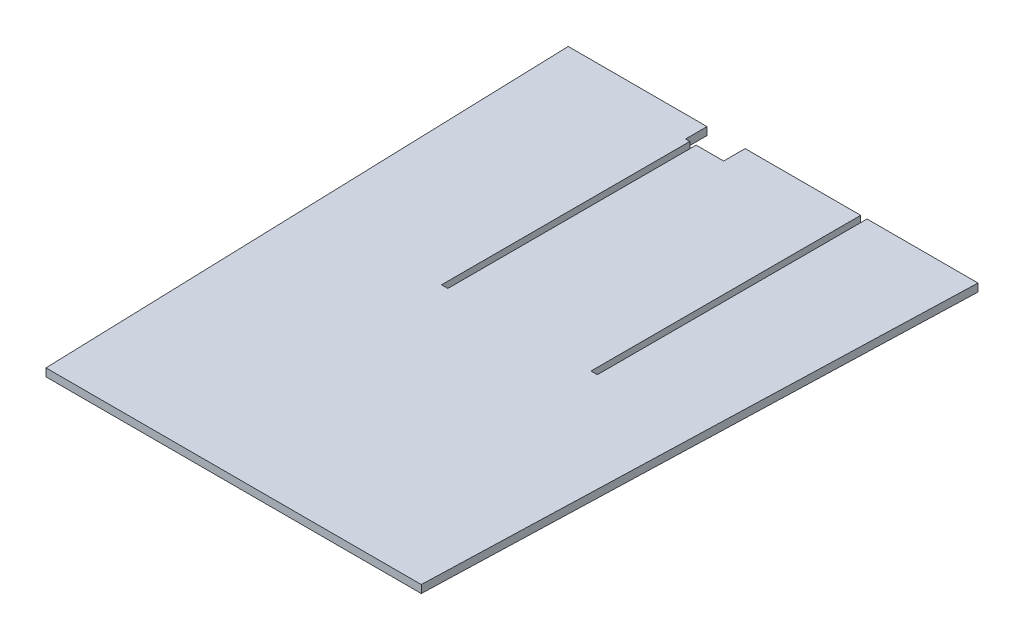
ISO-10303-21;
HEADER;
FILE_DESCRIPTION(('STEP AP214'),'2;1');
FILE_NAME('part.step','',(''),(''),'','','');
FILE_SCHEMA(('AUTOMOTIVE_DESIGN { 1 0 10303 214 1 1 1 1 }'));
ENDSEC;
DATA;
#1=APPLICATION_CONTEXT('core data for automotive mechanical design processes');
#2=APPLICATION_PROTOCOL_DEFINITION('international standard','automotive_design',2000,#1);
#3=PRODUCT_CONTEXT('',#1,'mechanical');
#4=PRODUCT('Part','Part','',(#3));
#5=PRODUCT_RELATED_PRODUCT_CATEGORY('part','',(#4));
#6=PRODUCT_DEFINITION_FORMATION('','',#4);
#7=PRODUCT_DEFINITION_CONTEXT('part definition',#1,'design');
#8=PRODUCT_DEFINITION('design','',#6,#7);
#9=PRODUCT_DEFINITION_SHAPE('','',#8);
#10=(LENGTH_UNIT() NAMED_UNIT(*) SI_UNIT(.MILLI.,.METRE.));
#11=(NAMED_UNIT(*) PLANE_ANGLE_UNIT() SI_UNIT($,.RADIAN.));
#12=(NAMED_UNIT(*) SI_UNIT($,.STERADIAN.) SOLID_ANGLE_UNIT());
#13=UNCERTAINTY_MEASURE_WITH_UNIT(LENGTH_MEASURE(1.E-05),#10,'distance_accuracy_value','');
#14=(GEOMETRIC_REPRESENTATION_CONTEXT(3) GLOBAL_UNCERTAINTY_ASSIGNED_CONTEXT((#13)) GLOBAL_UNIT_ASSIGNED_CONTEXT((#10,
#11,#12)) REPRESENTATION_CONTEXT('',''));
#15=CARTESIAN_POINT('',(0.,0.,0.));
#16=DIRECTION('',(0.,0.,1.));
#17=DIRECTION('',(1.,0.,0.));
#18=AXIS2_PLACEMENT_3D('',#15,#16,#17);
#19=CARTESIAN_POINT('',(198.579924435029,6.35,-458.637839183557));
#20=DIRECTION('',(0.,0.,-1.));
#21=DIRECTION('',(-1.,0.,0.));
#22=AXIS2_PLACEMENT_3D('',#19,#20,#21);
#23=PLANE('',#22);
#24=DIRECTION('',(1.,0.,0.));
#25=VECTOR('',#24,1.);
#26=CARTESIAN_POINT('',(198.579924435029,0.,-458.637839183557));
#27=LINE('',#26,#25);
#28=CARTESIAN_POINT('',(198.579924435029,0.,-458.637839183557));
#29=VERTEX_POINT('',#28);
#30=CARTESIAN_POINT('',(311.330524435029,0.,-458.637839183557));
#31=VERTEX_POINT('',#30);
#32=EDGE_CURVE('E192',#29,#31,#27,.T.);
#33=ORIENTED_EDGE('',*,*,#32,.F.);
#34=DIRECTION('',(0.,-1.,0.));
#35=VECTOR('',#34,1.);
#36=CARTESIAN_POINT('',(198.579924435029,6.35,-458.637839183557));
#37=LINE('',#36,#35);
#38=CARTESIAN_POINT('',(198.579924435029,6.35,-458.637839183557));
#39=VERTEX_POINT('',#38);
#40=EDGE_CURVE('E11',#39,#29,#37,.T.);
#41=ORIENTED_EDGE('',*,*,#40,.F.);
#42=DIRECTION('',(1.,0.,0.));
#43=VECTOR('',#42,1.);
#44=CARTESIAN_POINT('',(198.579924435029,6.35,-458.637839183557));
#45=LINE('',#44,#43);
#46=CARTESIAN_POINT('',(311.330524435029,6.35,-458.637839183557));
#47=VERTEX_POINT('',#46);
#48=EDGE_CURVE('E248',#39,#47,#45,.T.);
#49=ORIENTED_EDGE('',*,*,#48,.T.);
#50=DIRECTION('',(0.,-1.,0.));
#51=VECTOR('',#50,1.);
#52=CARTESIAN_POINT('',(311.330524435029,6.35,-458.637839183557));
#53=LINE('',#52,#51);
#54=EDGE_CURVE('E42',#47,#31,#53,.T.);
#55=ORIENTED_EDGE('',*,*,#54,.T.);
#56=EDGE_LOOP('',(#33,#41,#49,#55));
#57=FACE_BOUND('',#56,.T.);
#58=ADVANCED_FACE('F39',(#57),#23,.T.);
#59=CARTESIAN_POINT('',(198.579924435029,6.35,-458.637839183557));
#60=DIRECTION('',(0.99948913565602,0.,-0.0319604084076052));
#61=DIRECTION('',(-0.0319604084076052,0.,-0.999489135656021));
#62=AXIS2_PLACEMENT_3D('',#59,#60,#61);
#63=PLANE('',#62);
#64=DIRECTION('',(0.0319604084076052,0.,0.99948913565602));
#65=VECTOR('',#64,1.);
#66=CARTESIAN_POINT('',(198.579924435029,0.,-458.637839183557));
#67=LINE('',#66,#65);
#68=CARTESIAN_POINT('',(212.590534900145,0.,-20.4878391835568));
#69=VERTEX_POINT('',#68);
#70=EDGE_CURVE('E109',#29,#69,#67,.T.);
#71=ORIENTED_EDGE('',*,*,#70,.T.);
#72=DIRECTION('',(0.,-1.,0.));
#73=VECTOR('',#72,1.);
#74=CARTESIAN_POINT('',(212.590534900145,6.35,-20.4878391835568));
#75=LINE('',#74,#73);
#76=CARTESIAN_POINT('',(212.590534900145,6.35,-20.4878391835568));
#77=VERTEX_POINT('',#76);
#78=EDGE_CURVE('E49',#77,#69,#75,.T.);
#79=ORIENTED_EDGE('',*,*,#78,.F.);
#80=DIRECTION('',(0.0319604084076052,0.,0.99948913565602));
#81=VECTOR('',#80,1.);
#82=CARTESIAN_POINT('',(198.579924435029,6.35,-458.637839183557));
#83=LINE('',#82,#81);
#84=EDGE_CURVE('E166',#39,#77,#83,.T.);
#85=ORIENTED_EDGE('',*,*,#84,.F.);
#86=ORIENTED_EDGE('',*,*,#40,.T.);
#87=EDGE_LOOP('',(#71,#79,#85,#86));
#88=FACE_BOUND('',#87,.T.);
#89=ADVANCED_FACE('F386',(#88),#63,.F.);
#90=CARTESIAN_POINT('',(212.590534900145,6.35,-20.4878391835568));
#91=DIRECTION('',(0.,0.,-1.));
#92=DIRECTION('',(-1.,0.,0.));
#93=AXIS2_PLACEMENT_3D('',#90,#91,#92);
#94=PLANE('',#93);
#95=DIRECTION('',(1.,0.,0.));
#96=VECTOR('',#95,1.);
#97=CARTESIAN_POINT('',(212.590534900145,0.,-20.4878391835568));
#98=LINE('',#97,#96);
#99=CARTESIAN_POINT('',(517.390534900145,0.,-20.4878391835568));
#100=VERTEX_POINT('',#99);
#101=EDGE_CURVE('E174',#69,#100,#98,.T.);
#102=ORIENTED_EDGE('',*,*,#101,.T.);
#103=DIRECTION('',(0.,-1.,0.));
#104=VECTOR('',#103,1.);
#105=CARTESIAN_POINT('',(517.390534900145,6.35,-20.4878391835568));
#106=LINE('',#105,#104);
#107=CARTESIAN_POINT('',(517.390534900145,6.35,-20.4878391835568));
#108=VERTEX_POINT('',#107);
#109=EDGE_CURVE('E171',#108,#100,#106,.T.);
#110=ORIENTED_EDGE('',*,*,#109,.F.);
#111=DIRECTION('',(1.,0.,0.));
#112=VECTOR('',#111,1.);
#113=CARTESIAN_POINT('',(212.590534900145,6.35,-20.4878391835568));
#114=LINE('',#113,#112);
#115=EDGE_CURVE('E158',#77,#108,#114,.T.);
#116=ORIENTED_EDGE('',*,*,#115,.F.);
#117=ORIENTED_EDGE('',*,*,#78,.T.);
#118=EDGE_LOOP('',(#102,#110,#116,#117));
#119=FACE_BOUND('',#118,.T.);
#120=ADVANCED_FACE('F172',(#119),#94,.F.);
#121=CARTESIAN_POINT('',(531.401145365261,6.35,-458.637839183557));
#122=DIRECTION('',(0.99948913565602,0.,0.0319604084076051));
#123=DIRECTION('',(0.0319604084076051,0.,-0.999489135656021));
#124=AXIS2_PLACEMENT_3D('',#121,#122,#123);
#125=PLANE('',#124);
#126=DIRECTION('',(-0.0319604084076051,0.,0.99948913565602));
#127=VECTOR('',#126,1.);
#128=CARTESIAN_POINT('',(531.401145365261,0.,-458.637839183557));
#129=LINE('',#128,#127);
#130=CARTESIAN_POINT('',(531.401145365261,0.,-458.637839183557));
#131=VERTEX_POINT('',#130);
#132=EDGE_CURVE('E242',#131,#100,#129,.T.);
#133=ORIENTED_EDGE('',*,*,#132,.F.);
#134=DIRECTION('',(0.,-1.,0.));
#135=VECTOR('',#134,1.);
#136=CARTESIAN_POINT('',(531.401145365261,6.35,-458.637839183557));
#137=LINE('',#136,#135);
#138=CARTESIAN_POINT('',(531.401145365261,6.35,-458.637839183557));
#139=VERTEX_POINT('',#138);
#140=EDGE_CURVE('E179',#139,#131,#137,.T.);
#141=ORIENTED_EDGE('',*,*,#140,.F.);
#142=DIRECTION('',(-0.0319604084076051,0.,0.99948913565602));
#143=VECTOR('',#142,1.);
#144=CARTESIAN_POINT('',(531.401145365261,6.35,-458.637839183557));
#145=LINE('',#144,#143);
#146=EDGE_CURVE('E164',#139,#108,#145,.T.);
#147=ORIENTED_EDGE('',*,*,#146,.T.);
#148=ORIENTED_EDGE('',*,*,#109,.T.);
#149=EDGE_LOOP('',(#133,#141,#147,#148));
#150=FACE_BOUND('',#149,.T.);
#151=ADVANCED_FACE('F181',(#150),#125,.T.);
#152=CARTESIAN_POINT('',(441.305499435029,6.35,-458.637839183557));
#153=DIRECTION('',(0.,0.,-1.));
#154=DIRECTION('',(-1.,0.,0.));
#155=AXIS2_PLACEMENT_3D('',#152,#153,#154);
#156=PLANE('',#155);
#157=DIRECTION('',(1.,0.,0.));
#158=VECTOR('',#157,1.);
#159=CARTESIAN_POINT('',(441.305499435029,0.,-458.637839183557));
#160=LINE('',#159,#158);
#161=CARTESIAN_POINT('',(441.305499435029,0.,-458.637839183557));
#162=VERTEX_POINT('',#161);
#163=EDGE_CURVE('E238',#162,#131,#160,.T.);
#164=ORIENTED_EDGE('',*,*,#163,.F.);
#165=DIRECTION('',(0.,-1.,0.));
#166=VECTOR('',#165,1.);
#167=CARTESIAN_POINT('',(441.305499435029,6.35,-458.637839183557));
#168=LINE('',#167,#166);
#169=CARTESIAN_POINT('',(441.305499435029,6.35,-458.637839183557));
#170=VERTEX_POINT('',#169);
#171=EDGE_CURVE('E254',#170,#162,#168,.T.);
#172=ORIENTED_EDGE('',*,*,#171,.F.);
#173=DIRECTION('',(1.,0.,0.));
#174=VECTOR('',#173,1.);
#175=CARTESIAN_POINT('',(441.305499435029,6.35,-458.637839183557));
#176=LINE('',#175,#174);
#177=EDGE_CURVE('E183',#170,#139,#176,.T.);
#178=ORIENTED_EDGE('',*,*,#177,.T.);
#179=ORIENTED_EDGE('',*,*,#140,.T.);
#180=EDGE_LOOP('',(#164,#172,#178,#179));
#181=FACE_BOUND('',#180,.T.);
#182=ADVANCED_FACE('F296',(#181),#156,.T.);
#183=CARTESIAN_POINT('',(441.305499435029,6.35,-458.637839183557));
#184=DIRECTION('',(1.,0.,0.));
#185=DIRECTION('',(0.,0.,-1.));
#186=AXIS2_PLACEMENT_3D('',#183,#184,#185);
#187=PLANE('',#186);
#188=DIRECTION('',(0.,0.,1.));
#189=VECTOR('',#188,1.);
#190=CARTESIAN_POINT('',(441.305499435029,0.,-458.637839183557));
#191=LINE('',#190,#189);
#192=CARTESIAN_POINT('',(441.305499435029,0.,-239.562839183557));
#193=VERTEX_POINT('',#192);
#194=EDGE_CURVE('E234',#162,#193,#191,.T.);
#195=ORIENTED_EDGE('',*,*,#194,.T.);
#196=DIRECTION('',(0.,-1.,0.));
#197=VECTOR('',#196,1.);
#198=CARTESIAN_POINT('',(441.305499435029,6.35,-239.562839183557));
#199=LINE('',#198,#197);
#200=CARTESIAN_POINT('',(441.305499435029,6.35,-239.562839183557));
#201=VERTEX_POINT('',#200);
#202=EDGE_CURVE('E257',#201,#193,#199,.T.);
#203=ORIENTED_EDGE('',*,*,#202,.F.);
#204=DIRECTION('',(0.,0.,1.));
#205=VECTOR('',#204,1.);
#206=CARTESIAN_POINT('',(441.305499435029,6.35,-458.637839183557));
#207=LINE('',#206,#205);
#208=EDGE_CURVE('E186',#170,#201,#207,.T.);
#209=ORIENTED_EDGE('',*,*,#208,.F.);
#210=ORIENTED_EDGE('',*,*,#171,.T.);
#211=EDGE_LOOP('',(#195,#203,#209,#210));
#212=FACE_BOUND('',#211,.T.);
#213=ADVANCED_FACE('F306',(#212),#187,.F.);
#214=CARTESIAN_POINT('',(436.146124435029,6.35,-239.562839183557));
#215=DIRECTION('',(0.,0.,-1.));
#216=DIRECTION('',(-1.,0.,0.));
#217=AXIS2_PLACEMENT_3D('',#214,#215,#216);
#218=PLANE('',#217);
#219=DIRECTION('',(1.,0.,0.));
#220=VECTOR('',#219,1.);
#221=CARTESIAN_POINT('',(436.146124435029,0.,-239.562839183557));
#222=LINE('',#221,#220);
#223=CARTESIAN_POINT('',(436.146124435029,0.,-239.562839183557));
#224=VERTEX_POINT('',#223);
#225=EDGE_CURVE('E230',#224,#193,#222,.T.);
#226=ORIENTED_EDGE('',*,*,#225,.F.);
#227=DIRECTION('',(0.,-1.,0.));
#228=VECTOR('',#227,1.);
#229=CARTESIAN_POINT('',(436.146124435029,6.35,-239.562839183557));
#230=LINE('',#229,#228);
#231=CARTESIAN_POINT('',(436.146124435029,6.35,-239.562839183557));
#232=VERTEX_POINT('',#231);
#233=EDGE_CURVE('E260',#232,#224,#230,.T.);
#234=ORIENTED_EDGE('',*,*,#233,.F.);
#235=DIRECTION('',(1.,0.,0.));
#236=VECTOR('',#235,1.);
#237=CARTESIAN_POINT('',(436.146124435029,6.35,-239.562839183557));
#238=LINE('',#237,#236);
#239=EDGE_CURVE('E302',#232,#201,#238,.T.);
#240=ORIENTED_EDGE('',*,*,#239,.T.);
#241=ORIENTED_EDGE('',*,*,#202,.T.);
#242=EDGE_LOOP('',(#226,#234,#240,#241));
#243=FACE_BOUND('',#242,.T.);
#244=ADVANCED_FACE('F309',(#243),#218,.T.);
#245=CARTESIAN_POINT('',(436.146124435029,6.35,-458.637839183557));
#246=DIRECTION('',(1.,0.,0.));
#247=DIRECTION('',(0.,0.,-1.));
#248=AXIS2_PLACEMENT_3D('',#245,#246,#247);
#249=PLANE('',#248);
#250=DIRECTION('',(0.,0.,1.));
#251=VECTOR('',#250,1.);
#252=CARTESIAN_POINT('',(436.146124435029,0.,-458.637839183557));
#253=LINE('',#252,#251);
#254=CARTESIAN_POINT('',(436.146124435029,0.,-458.637839183557));
#255=VERTEX_POINT('',#254);
#256=EDGE_CURVE('E226',#255,#224,#253,.T.);
#257=ORIENTED_EDGE('',*,*,#256,.F.);
#258=DIRECTION('',(0.,-1.,0.));
#259=VECTOR('',#258,1.);
#260=CARTESIAN_POINT('',(436.146124435029,6.35,-458.637839183557));
#261=LINE('',#260,#259);
#262=CARTESIAN_POINT('',(436.146124435029,6.35,-458.637839183557));
#263=VERTEX_POINT('',#262);
#264=EDGE_CURVE('E263',#263,#255,#261,.T.);
#265=ORIENTED_EDGE('',*,*,#264,.F.);
#266=DIRECTION('',(0.,0.,1.));
#267=VECTOR('',#266,1.);
#268=CARTESIAN_POINT('',(436.146124435029,6.35,-458.637839183557));
#269=LINE('',#268,#267);
#270=EDGE_CURVE('E311',#263,#232,#269,.T.);
#271=ORIENTED_EDGE('',*,*,#270,.T.);
#272=ORIENTED_EDGE('',*,*,#233,.T.);
#273=EDGE_LOOP('',(#257,#265,#271,#272));
#274=FACE_BOUND('',#273,.T.);
#275=ADVANCED_FACE('F376',(#274),#249,.T.);
#276=CARTESIAN_POINT('',(342.280424435028,6.35,-458.637839183557));
#277=DIRECTION('',(0.,0.,-1.));
#278=DIRECTION('',(-1.,0.,0.));
#279=AXIS2_PLACEMENT_3D('',#276,#277,#278);
#280=PLANE('',#279);
#281=DIRECTION('',(1.,0.,0.));
#282=VECTOR('',#281,1.);
#283=CARTESIAN_POINT('',(342.280424435028,0.,-458.637839183557));
#284=LINE('',#283,#282);
#285=CARTESIAN_POINT('',(342.280424435028,0.,-458.637839183557));
#286=VERTEX_POINT('',#285);
#287=EDGE_CURVE('E222',#286,#255,#284,.T.);
#288=ORIENTED_EDGE('',*,*,#287,.F.);
#289=DIRECTION('',(0.,-1.,0.));
#290=VECTOR('',#289,1.);
#291=CARTESIAN_POINT('',(342.280424435028,6.35,-458.637839183557));
#292=LINE('',#291,#290);
#293=CARTESIAN_POINT('',(342.280424435028,6.35,-458.637839183557));
#294=VERTEX_POINT('',#293);
#295=EDGE_CURVE('E266',#294,#286,#292,.T.);
#296=ORIENTED_EDGE('',*,*,#295,.F.);
#297=DIRECTION('',(1.,0.,0.));
#298=VECTOR('',#297,1.);
#299=CARTESIAN_POINT('',(342.280424435028,6.35,-458.637839183557));
#300=LINE('',#299,#298);
#301=EDGE_CURVE('E314',#294,#263,#300,.T.);
#302=ORIENTED_EDGE('',*,*,#301,.T.);
#303=ORIENTED_EDGE('',*,*,#264,.T.);
#304=EDGE_LOOP('',(#288,#296,#302,#303));
#305=FACE_BOUND('',#304,.T.);
#306=ADVANCED_FACE('F373',(#305),#280,.T.);
#307=CARTESIAN_POINT('',(342.280424435028,6.35,-458.637839183557));
#308=DIRECTION('',(1.,0.,0.));
#309=DIRECTION('',(0.,0.,-1.));
#310=AXIS2_PLACEMENT_3D('',#307,#308,#309);
#311=PLANE('',#310);
#312=DIRECTION('',(0.,0.,1.));
#313=VECTOR('',#312,1.);
#314=CARTESIAN_POINT('',(342.280424435028,0.,-458.637839183557));
#315=LINE('',#314,#313);
#316=CARTESIAN_POINT('',(342.280424435028,0.,-441.175339183557));
#317=VERTEX_POINT('',#316);
#318=EDGE_CURVE('E219',#286,#317,#315,.T.);
#319=ORIENTED_EDGE('',*,*,#318,.T.);
#320=DIRECTION('',(0.,-1.,0.));
#321=VECTOR('',#320,1.);
#322=CARTESIAN_POINT('',(342.280424435028,6.35,-441.175339183557));
#323=LINE('',#322,#321);
#324=CARTESIAN_POINT('',(342.280424435028,6.35,-441.175339183557));
#325=VERTEX_POINT('',#324);
#326=EDGE_CURVE('E269',#325,#317,#323,.T.);
#327=ORIENTED_EDGE('',*,*,#326,.F.);
#328=DIRECTION('',(0.,0.,1.));
#329=VECTOR('',#328,1.);
#330=CARTESIAN_POINT('',(342.280424435028,6.35,-458.637839183557));
#331=LINE('',#330,#329);
#332=EDGE_CURVE('E320',#294,#325,#331,.T.);
#333=ORIENTED_EDGE('',*,*,#332,.F.);
#334=ORIENTED_EDGE('',*,*,#295,.T.);
#335=EDGE_LOOP('',(#319,#327,#333,#334));
#336=FACE_BOUND('',#335,.T.);
#337=ADVANCED_FACE('F369',(#336),#311,.F.);
#338=CARTESIAN_POINT('',(342.280424435028,6.35,-441.175339183557));
#339=DIRECTION('',(0.,0.,1.));
#340=DIRECTION('',(1.,0.,0.));
#341=AXIS2_PLACEMENT_3D('',#338,#339,#340);
#342=PLANE('',#341);
#343=DIRECTION('',(-1.,0.,0.));
#344=VECTOR('',#343,1.);
#345=CARTESIAN_POINT('',(342.280424435028,0.,-441.175339183557));
#346=LINE('',#345,#344);
#347=CARTESIAN_POINT('',(319.942711935029,0.,-441.175339183557));
#348=VERTEX_POINT('',#347);
#349=EDGE_CURVE('E216',#317,#348,#346,.T.);
#350=ORIENTED_EDGE('',*,*,#349,.T.);
#351=DIRECTION('',(0.,-1.,0.));
#352=VECTOR('',#351,1.);
#353=CARTESIAN_POINT('',(319.942711935029,6.35,-441.175339183557));
#354=LINE('',#353,#352);
#355=CARTESIAN_POINT('',(319.942711935029,6.35,-441.175339183557));
#356=VERTEX_POINT('',#355);
#357=EDGE_CURVE('E273',#356,#348,#354,.T.);
#358=ORIENTED_EDGE('',*,*,#357,.F.);
#359=DIRECTION('',(-1.,0.,0.));
#360=VECTOR('',#359,1.);
#361=CARTESIAN_POINT('',(342.280424435028,6.35,-441.175339183557));
#362=LINE('',#361,#360);
#363=EDGE_CURVE('E323',#325,#356,#362,.T.);
#364=ORIENTED_EDGE('',*,*,#363,.F.);
#365=ORIENTED_EDGE('',*,*,#326,.T.);
#366=EDGE_LOOP('',(#350,#358,#364,#365));
#367=FACE_BOUND('',#366,.T.);
#368=ADVANCED_FACE('F365',(#367),#342,.F.);
#369=CARTESIAN_POINT('',(319.942711935029,6.35,-441.175339183557));
#370=DIRECTION('',(1.,0.,0.));
#371=DIRECTION('',(0.,0.,-1.));
#372=AXIS2_PLACEMENT_3D('',#369,#370,#371);
#373=PLANE('',#372);
#374=DIRECTION('',(0.,0.,1.));
#375=VECTOR('',#374,1.);
#376=CARTESIAN_POINT('',(319.942711935029,0.,-441.175339183557));
#377=LINE('',#376,#375);
#378=CARTESIAN_POINT('',(319.942711935029,0.,-239.562839183557));
#379=VERTEX_POINT('',#378);
#380=EDGE_CURVE('E212',#348,#379,#377,.T.);
#381=ORIENTED_EDGE('',*,*,#380,.T.);
#382=DIRECTION('',(0.,-1.,0.));
#383=VECTOR('',#382,1.);
#384=CARTESIAN_POINT('',(319.942711935029,6.35,-239.562839183557));
#385=LINE('',#384,#383);
#386=CARTESIAN_POINT('',(319.942711935029,6.35,-239.562839183557));
#387=VERTEX_POINT('',#386);
#388=EDGE_CURVE('E277',#387,#379,#385,.T.);
#389=ORIENTED_EDGE('',*,*,#388,.F.);
#390=DIRECTION('',(0.,0.,1.));
#391=VECTOR('',#390,1.);
#392=CARTESIAN_POINT('',(319.942711935029,6.35,-441.175339183557));
#393=LINE('',#392,#391);
#394=EDGE_CURVE('E326',#356,#387,#393,.T.);
#395=ORIENTED_EDGE('',*,*,#394,.F.);
#396=ORIENTED_EDGE('',*,*,#357,.T.);
#397=EDGE_LOOP('',(#381,#389,#395,#396));
#398=FACE_BOUND('',#397,.T.);
#399=ADVANCED_FACE('F360',(#398),#373,.F.);
#400=CARTESIAN_POINT('',(314.783336935029,6.35,-239.562839183557));
#401=DIRECTION('',(0.,0.,-1.));
#402=DIRECTION('',(-1.,0.,0.));
#403=AXIS2_PLACEMENT_3D('',#400,#401,#402);
#404=PLANE('',#403);
#405=DIRECTION('',(1.,0.,0.));
#406=VECTOR('',#405,1.);
#407=CARTESIAN_POINT('',(314.783336935029,0.,-239.562839183557));
#408=LINE('',#407,#406);
#409=CARTESIAN_POINT('',(314.783336935029,0.,-239.562839183557));
#410=VERTEX_POINT('',#409);
#411=EDGE_CURVE('E208',#410,#379,#408,.T.);
#412=ORIENTED_EDGE('',*,*,#411,.F.);
#413=DIRECTION('',(0.,-1.,0.));
#414=VECTOR('',#413,1.);
#415=CARTESIAN_POINT('',(314.783336935029,6.35,-239.562839183557));
#416=LINE('',#415,#414);
#417=CARTESIAN_POINT('',(314.783336935029,6.35,-239.562839183557));
#418=VERTEX_POINT('',#417);
#419=EDGE_CURVE('E280',#418,#410,#416,.T.);
#420=ORIENTED_EDGE('',*,*,#419,.F.);
#421=DIRECTION('',(1.,0.,0.));
#422=VECTOR('',#421,1.);
#423=CARTESIAN_POINT('',(314.783336935029,6.35,-239.562839183557));
#424=LINE('',#423,#422);
#425=EDGE_CURVE('E329',#418,#387,#424,.T.);
#426=ORIENTED_EDGE('',*,*,#425,.T.);
#427=ORIENTED_EDGE('',*,*,#388,.T.);
#428=EDGE_LOOP('',(#412,#420,#426,#427));
#429=FACE_BOUND('',#428,.T.);
#430=ADVANCED_FACE('F354',(#429),#404,.T.);
#431=CARTESIAN_POINT('',(314.783336935029,6.35,-441.175339183557));
#432=DIRECTION('',(1.,0.,0.));
#433=DIRECTION('',(0.,0.,-1.));
#434=AXIS2_PLACEMENT_3D('',#431,#432,#433);
#435=PLANE('',#434);
#436=DIRECTION('',(0.,0.,1.));
#437=VECTOR('',#436,1.);
#438=CARTESIAN_POINT('',(314.783336935029,0.,-441.175339183557));
#439=LINE('',#438,#437);
#440=CARTESIAN_POINT('',(314.783336935029,0.,-441.175339183557));
#441=VERTEX_POINT('',#440);
#442=EDGE_CURVE('E204',#441,#410,#439,.T.);
#443=ORIENTED_EDGE('',*,*,#442,.F.);
#444=DIRECTION('',(0.,-1.,0.));
#445=VECTOR('',#444,1.);
#446=CARTESIAN_POINT('',(314.783336935029,6.35,-441.175339183557));
#447=LINE('',#446,#445);
#448=CARTESIAN_POINT('',(314.783336935029,6.35,-441.175339183557));
#449=VERTEX_POINT('',#448);
#450=EDGE_CURVE('E283',#449,#441,#447,.T.);
#451=ORIENTED_EDGE('',*,*,#450,.F.);
#452=DIRECTION('',(0.,0.,1.));
#453=VECTOR('',#452,1.);
#454=CARTESIAN_POINT('',(314.783336935029,6.35,-441.175339183557));
#455=LINE('',#454,#453);
#456=EDGE_CURVE('E333',#449,#418,#455,.T.);
#457=ORIENTED_EDGE('',*,*,#456,.T.);
#458=ORIENTED_EDGE('',*,*,#419,.T.);
#459=EDGE_LOOP('',(#443,#451,#457,#458));
#460=FACE_BOUND('',#459,.T.);
#461=ADVANCED_FACE('F351',(#460),#435,.T.);
#462=CARTESIAN_POINT('',(314.783336935029,6.35,-441.175339183557));
#463=DIRECTION('',(0.,0.,1.));
#464=DIRECTION('',(1.,0.,0.));
#465=AXIS2_PLACEMENT_3D('',#462,#463,#464);
#466=PLANE('',#465);
#467=DIRECTION('',(-1.,0.,0.));
#468=VECTOR('',#467,1.);
#469=CARTESIAN_POINT('',(314.783336935029,0.,-441.175339183557));
#470=LINE('',#469,#468);
#471=CARTESIAN_POINT('',(311.330524435029,0.,-441.175339183557));
#472=VERTEX_POINT('',#471);
#473=EDGE_CURVE('E200',#441,#472,#470,.T.);
#474=ORIENTED_EDGE('',*,*,#473,.T.);
#475=DIRECTION('',(0.,-1.,0.));
#476=VECTOR('',#475,1.);
#477=CARTESIAN_POINT('',(311.330524435029,6.35,-441.175339183557));
#478=LINE('',#477,#476);
#479=CARTESIAN_POINT('',(311.330524435029,6.35,-441.175339183557));
#480=VERTEX_POINT('',#479);
#481=EDGE_CURVE('E285',#480,#472,#478,.T.);
#482=ORIENTED_EDGE('',*,*,#481,.F.);
#483=DIRECTION('',(-1.,0.,0.));
#484=VECTOR('',#483,1.);
#485=CARTESIAN_POINT('',(314.783336935029,6.35,-441.175339183557));
#486=LINE('',#485,#484);
#487=EDGE_CURVE('E337',#449,#480,#486,.T.);
#488=ORIENTED_EDGE('',*,*,#487,.F.);
#489=ORIENTED_EDGE('',*,*,#450,.T.);
#490=EDGE_LOOP('',(#474,#482,#488,#489));
#491=FACE_BOUND('',#490,.T.);
#492=ADVANCED_FACE('F348',(#491),#466,.F.);
#493=CARTESIAN_POINT('',(311.330524435029,6.35,-458.637839183557));
#494=DIRECTION('',(1.,0.,0.));
#495=DIRECTION('',(0.,0.,-1.));
#496=AXIS2_PLACEMENT_3D('',#493,#494,#495);
#497=PLANE('',#496);
#498=DIRECTION('',(0.,0.,1.));
#499=VECTOR('',#498,1.);
#500=CARTESIAN_POINT('',(311.330524435029,0.,-458.637839183557));
#501=LINE('',#500,#499);
#502=EDGE_CURVE('E196',#31,#472,#501,.T.);
#503=ORIENTED_EDGE('',*,*,#502,.F.);
#504=ORIENTED_EDGE('',*,*,#54,.F.);
#505=DIRECTION('',(0.,0.,1.));
#506=VECTOR('',#505,1.);
#507=CARTESIAN_POINT('',(311.330524435029,6.35,-458.637839183557));
#508=LINE('',#507,#506);
#509=EDGE_CURVE('E340',#47,#480,#508,.T.);
#510=ORIENTED_EDGE('',*,*,#509,.T.);
#511=ORIENTED_EDGE('',*,*,#481,.T.);
#512=EDGE_LOOP('',(#503,#504,#510,#511));
#513=FACE_BOUND('',#512,.T.);
#514=ADVANCED_FACE('F289',(#513),#497,.T.);
#515=CARTESIAN_POINT('',(0.,6.35,0.));
#516=DIRECTION('',(0.,-1.,0.));
#517=DIRECTION('',(0.,0.,-1.));
#518=AXIS2_PLACEMENT_3D('',#515,#516,#517);
#519=PLANE('',#518);
#520=ORIENTED_EDGE('',*,*,#48,.F.);
#521=ORIENTED_EDGE('',*,*,#84,.T.);
#522=ORIENTED_EDGE('',*,*,#115,.T.);
#523=ORIENTED_EDGE('',*,*,#146,.F.);
#524=ORIENTED_EDGE('',*,*,#177,.F.);
#525=ORIENTED_EDGE('',*,*,#208,.T.);
#526=ORIENTED_EDGE('',*,*,#239,.F.);
#527=ORIENTED_EDGE('',*,*,#270,.F.);
#528=ORIENTED_EDGE('',*,*,#301,.F.);
#529=ORIENTED_EDGE('',*,*,#332,.T.);
#530=ORIENTED_EDGE('',*,*,#363,.T.);
#531=ORIENTED_EDGE('',*,*,#394,.T.);
#532=ORIENTED_EDGE('',*,*,#425,.F.);
#533=ORIENTED_EDGE('',*,*,#456,.F.);
#534=ORIENTED_EDGE('',*,*,#487,.T.);
#535=ORIENTED_EDGE('',*,*,#509,.F.);
#536=EDGE_LOOP('',(#520,#521,#522,#523,#524,#525,#526,#527,#528,#529,#530,#531,#532,#533,#534,#535));
#537=FACE_BOUND('',#536,.T.);
#538=ADVANCED_FACE('F161',(#537),#519,.F.);
#539=CARTESIAN_POINT('',(0.,0.,0.));
#540=DIRECTION('',(0.,-1.,0.));
#541=DIRECTION('',(0.,0.,-1.));
#542=AXIS2_PLACEMENT_3D('',#539,#540,#541);
#543=PLANE('',#542);
#544=ORIENTED_EDGE('',*,*,#32,.T.);
#545=ORIENTED_EDGE('',*,*,#502,.T.);
#546=ORIENTED_EDGE('',*,*,#473,.F.);
#547=ORIENTED_EDGE('',*,*,#442,.T.);
#548=ORIENTED_EDGE('',*,*,#411,.T.);
#549=ORIENTED_EDGE('',*,*,#380,.F.);
#550=ORIENTED_EDGE('',*,*,#349,.F.);
#551=ORIENTED_EDGE('',*,*,#318,.F.);
#552=ORIENTED_EDGE('',*,*,#287,.T.);
#553=ORIENTED_EDGE('',*,*,#256,.T.);
#554=ORIENTED_EDGE('',*,*,#225,.T.);
#555=ORIENTED_EDGE('',*,*,#194,.F.);
#556=ORIENTED_EDGE('',*,*,#163,.T.);
#557=ORIENTED_EDGE('',*,*,#132,.T.);
#558=ORIENTED_EDGE('',*,*,#101,.F.);
#559=ORIENTED_EDGE('',*,*,#70,.F.);
#560=EDGE_LOOP('',(#544,#545,#546,#547,#548,#549,#550,#551,#552,#553,#554,#555,#556,#557,#558,#559));
#561=FACE_BOUND('',#560,.T.);
#562=ADVANCED_FACE('F292',(#561),#543,.T.);
#563=CLOSED_SHELL('',(#58,#89,#120,#151,#182,#213,#244,#275,#306,#337,#368,#399,#430,#461,#492,
#514,#538,#562));
#564=MANIFOLD_SOLID_BREP('B2',#563);
#565=ADVANCED_BREP_SHAPE_REPRESENTATION('',(#18,#564),#14);
#566=SHAPE_DEFINITION_REPRESENTATION(#9,#565);
ENDSEC;
END-ISO-10303-21;
